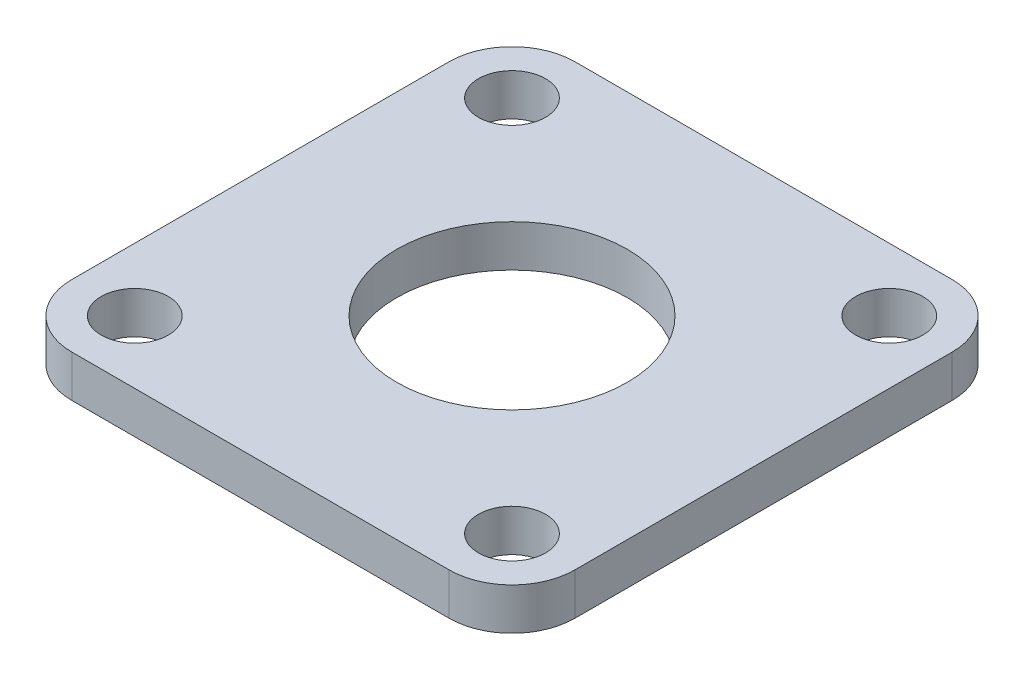
ISO-10303-21;
HEADER;
FILE_DESCRIPTION(('STEP AP214'),'2;1');
FILE_NAME('part.step','',(''),(''),'','','');
FILE_SCHEMA(('AUTOMOTIVE_DESIGN { 1 0 10303 214 1 1 1 1 }'));
ENDSEC;
DATA;
#1=APPLICATION_CONTEXT('core data for automotive mechanical design processes');
#2=APPLICATION_PROTOCOL_DEFINITION('international standard','automotive_design',2000,#1);
#3=PRODUCT_CONTEXT('',#1,'mechanical');
#4=PRODUCT('Part','Part','',(#3));
#5=PRODUCT_RELATED_PRODUCT_CATEGORY('part','',(#4));
#6=PRODUCT_DEFINITION_FORMATION('','',#4);
#7=PRODUCT_DEFINITION_CONTEXT('part definition',#1,'design');
#8=PRODUCT_DEFINITION('design','',#6,#7);
#9=PRODUCT_DEFINITION_SHAPE('','',#8);
#10=(LENGTH_UNIT() NAMED_UNIT(*) SI_UNIT(.MILLI.,.METRE.));
#11=(NAMED_UNIT(*) PLANE_ANGLE_UNIT() SI_UNIT($,.RADIAN.));
#12=(NAMED_UNIT(*) SI_UNIT($,.STERADIAN.) SOLID_ANGLE_UNIT());
#13=UNCERTAINTY_MEASURE_WITH_UNIT(LENGTH_MEASURE(1.E-05),#10,'distance_accuracy_value','');
#14=(GEOMETRIC_REPRESENTATION_CONTEXT(3) GLOBAL_UNCERTAINTY_ASSIGNED_CONTEXT((#13)) GLOBAL_UNIT_ASSIGNED_CONTEXT((#10,
#11,#12)) REPRESENTATION_CONTEXT('',''));
#15=CARTESIAN_POINT('',(0.,0.,0.));
#16=DIRECTION('',(0.,0.,1.));
#17=DIRECTION('',(1.,0.,0.));
#18=AXIS2_PLACEMENT_3D('',#15,#16,#17);
#19=CARTESIAN_POINT('',(12.,2.,12.));
#20=DIRECTION('',(-1.,0.,0.));
#21=DIRECTION('',(0.,0.,1.));
#22=AXIS2_PLACEMENT_3D('',#19,#20,#21);
#23=PLANE('',#22);
#24=DIRECTION('',(0.,0.,-1.));
#25=VECTOR('',#24,1.);
#26=CARTESIAN_POINT('',(12.,0.,12.));
#27=LINE('',#26,#25);
#28=CARTESIAN_POINT('',(12.,0.,9.));
#29=VERTEX_POINT('',#28);
#30=CARTESIAN_POINT('',(12.,0.,-9.));
#31=VERTEX_POINT('',#30);
#32=EDGE_CURVE('E181',#29,#31,#27,.T.);
#33=ORIENTED_EDGE('',*,*,#32,.T.);
#34=DIRECTION('',(0.,-1.,0.));
#35=VECTOR('',#34,1.);
#36=CARTESIAN_POINT('',(12.,2.,-9.));
#37=LINE('',#36,#35);
#38=CARTESIAN_POINT('',(12.,2.,-9.));
#39=VERTEX_POINT('',#38);
#40=EDGE_CURVE('E11',#31,#39,#37,.F.);
#41=ORIENTED_EDGE('',*,*,#40,.T.);
#42=DIRECTION('',(0.,0.,-1.));
#43=VECTOR('',#42,1.);
#44=CARTESIAN_POINT('',(12.,2.,12.));
#45=LINE('',#44,#43);
#46=CARTESIAN_POINT('',(12.,2.,9.));
#47=VERTEX_POINT('',#46);
#48=EDGE_CURVE('E134',#47,#39,#45,.T.);
#49=ORIENTED_EDGE('',*,*,#48,.F.);
#50=DIRECTION('',(0.,-1.,0.));
#51=VECTOR('',#50,1.);
#52=CARTESIAN_POINT('',(12.,2.,9.));
#53=LINE('',#52,#51);
#54=EDGE_CURVE('E47',#47,#29,#53,.T.);
#55=ORIENTED_EDGE('',*,*,#54,.T.);
#56=EDGE_LOOP('',(#33,#41,#49,#55));
#57=FACE_BOUND('',#56,.T.);
#58=ADVANCED_FACE('F38',(#57),#23,.F.);
#59=CARTESIAN_POINT('',(-12.,2.,-12.));
#60=DIRECTION('',(0.,0.,1.));
#61=DIRECTION('',(1.,0.,0.));
#62=AXIS2_PLACEMENT_3D('',#59,#60,#61);
#63=PLANE('',#62);
#64=DIRECTION('',(-1.,0.,0.));
#65=VECTOR('',#64,1.);
#66=CARTESIAN_POINT('',(-12.,0.,-12.));
#67=LINE('',#66,#65);
#68=CARTESIAN_POINT('',(9.,0.,-12.));
#69=VERTEX_POINT('',#68);
#70=CARTESIAN_POINT('',(-9.,0.,-12.));
#71=VERTEX_POINT('',#70);
#72=EDGE_CURVE('E141',#69,#71,#67,.T.);
#73=ORIENTED_EDGE('',*,*,#72,.T.);
#74=DIRECTION('',(0.,-1.,0.));
#75=VECTOR('',#74,1.);
#76=CARTESIAN_POINT('',(-9.,2.,-12.));
#77=LINE('',#76,#75);
#78=CARTESIAN_POINT('',(-9.,2.,-12.));
#79=VERTEX_POINT('',#78);
#80=EDGE_CURVE('E54',#71,#79,#77,.F.);
#81=ORIENTED_EDGE('',*,*,#80,.T.);
#82=DIRECTION('',(-1.,0.,0.));
#83=VECTOR('',#82,1.);
#84=CARTESIAN_POINT('',(-12.,2.,-12.));
#85=LINE('',#84,#83);
#86=CARTESIAN_POINT('',(9.,2.,-12.));
#87=VERTEX_POINT('',#86);
#88=EDGE_CURVE('E139',#87,#79,#85,.T.);
#89=ORIENTED_EDGE('',*,*,#88,.F.);
#90=DIRECTION('',(0.,-1.,0.));
#91=VECTOR('',#90,1.);
#92=CARTESIAN_POINT('',(9.,2.,-12.));
#93=LINE('',#92,#91);
#94=EDGE_CURVE('E170',#87,#69,#93,.T.);
#95=ORIENTED_EDGE('',*,*,#94,.T.);
#96=EDGE_LOOP('',(#73,#81,#89,#95));
#97=FACE_BOUND('',#96,.T.);
#98=ADVANCED_FACE('F266',(#97),#63,.F.);
#99=CARTESIAN_POINT('',(-12.,2.,12.));
#100=DIRECTION('',(1.,0.,0.));
#101=DIRECTION('',(0.,0.,-1.));
#102=AXIS2_PLACEMENT_3D('',#99,#100,#101);
#103=PLANE('',#102);
#104=DIRECTION('',(0.,0.,1.));
#105=VECTOR('',#104,1.);
#106=CARTESIAN_POINT('',(-12.,0.,12.));
#107=LINE('',#106,#105);
#108=CARTESIAN_POINT('',(-12.,0.,-9.));
#109=VERTEX_POINT('',#108);
#110=CARTESIAN_POINT('',(-12.,0.,9.));
#111=VERTEX_POINT('',#110);
#112=EDGE_CURVE('E135',#109,#111,#107,.T.);
#113=ORIENTED_EDGE('',*,*,#112,.T.);
#114=DIRECTION('',(0.,-1.,0.));
#115=VECTOR('',#114,1.);
#116=CARTESIAN_POINT('',(-12.,2.,9.));
#117=LINE('',#116,#115);
#118=CARTESIAN_POINT('',(-12.,2.,9.));
#119=VERTEX_POINT('',#118);
#120=EDGE_CURVE('E110',#111,#119,#117,.F.);
#121=ORIENTED_EDGE('',*,*,#120,.T.);
#122=DIRECTION('',(0.,0.,1.));
#123=VECTOR('',#122,1.);
#124=CARTESIAN_POINT('',(-12.,2.,12.));
#125=LINE('',#124,#123);
#126=CARTESIAN_POINT('',(-12.,2.,-9.));
#127=VERTEX_POINT('',#126);
#128=EDGE_CURVE('E197',#127,#119,#125,.T.);
#129=ORIENTED_EDGE('',*,*,#128,.F.);
#130=DIRECTION('',(0.,-1.,0.));
#131=VECTOR('',#130,1.);
#132=CARTESIAN_POINT('',(-12.,2.,-9.));
#133=LINE('',#132,#131);
#134=EDGE_CURVE('E116',#127,#109,#133,.T.);
#135=ORIENTED_EDGE('',*,*,#134,.T.);
#136=EDGE_LOOP('',(#113,#121,#129,#135));
#137=FACE_BOUND('',#136,.T.);
#138=ADVANCED_FACE('F263',(#137),#103,.F.);
#139=CARTESIAN_POINT('',(-12.,2.,12.));
#140=DIRECTION('',(0.,0.,-1.));
#141=DIRECTION('',(-1.,0.,0.));
#142=AXIS2_PLACEMENT_3D('',#139,#140,#141);
#143=PLANE('',#142);
#144=DIRECTION('',(1.,0.,0.));
#145=VECTOR('',#144,1.);
#146=CARTESIAN_POINT('',(-12.,2.,12.));
#147=LINE('',#146,#145);
#148=CARTESIAN_POINT('',(-9.,2.,12.));
#149=VERTEX_POINT('',#148);
#150=CARTESIAN_POINT('',(9.,2.,12.));
#151=VERTEX_POINT('',#150);
#152=EDGE_CURVE('E126',#149,#151,#147,.T.);
#153=ORIENTED_EDGE('',*,*,#152,.F.);
#154=DIRECTION('',(0.,-1.,0.));
#155=VECTOR('',#154,1.);
#156=CARTESIAN_POINT('',(-9.,2.,12.));
#157=LINE('',#156,#155);
#158=CARTESIAN_POINT('',(-9.,0.,12.));
#159=VERTEX_POINT('',#158);
#160=EDGE_CURVE('E109',#149,#159,#157,.T.);
#161=ORIENTED_EDGE('',*,*,#160,.T.);
#162=DIRECTION('',(1.,0.,0.));
#163=VECTOR('',#162,1.);
#164=CARTESIAN_POINT('',(-12.,0.,12.));
#165=LINE('',#164,#163);
#166=CARTESIAN_POINT('',(9.,0.,12.));
#167=VERTEX_POINT('',#166);
#168=EDGE_CURVE('E123',#159,#167,#165,.T.);
#169=ORIENTED_EDGE('',*,*,#168,.T.);
#170=DIRECTION('',(0.,-1.,0.));
#171=VECTOR('',#170,1.);
#172=CARTESIAN_POINT('',(9.,2.,12.));
#173=LINE('',#172,#171);
#174=EDGE_CURVE('E129',#167,#151,#173,.F.);
#175=ORIENTED_EDGE('',*,*,#174,.T.);
#176=EDGE_LOOP('',(#153,#161,#169,#175));
#177=FACE_BOUND('',#176,.T.);
#178=ADVANCED_FACE('F122',(#177),#143,.F.);
#179=CARTESIAN_POINT('',(0.,2.,0.));
#180=DIRECTION('',(0.,-1.,0.));
#181=DIRECTION('',(0.,0.,-1.));
#182=AXIS2_PLACEMENT_3D('',#179,#180,#181);
#183=PLANE('',#182);
#184=CARTESIAN_POINT('',(0.,2.,0.));
#185=DIRECTION('',(0.,1.,0.));
#186=DIRECTION('',(0.,0.,1.));
#187=AXIS2_PLACEMENT_3D('',#184,#185,#186);
#188=CIRCLE('',#187,5.5);
#189=CARTESIAN_POINT('',(0.,2.,5.5));
#190=VERTEX_POINT('',#189);
#191=EDGE_CURVE('E231',#190,#190,#188,.T.);
#192=ORIENTED_EDGE('',*,*,#191,.F.);
#193=EDGE_LOOP('',(#192));
#194=FACE_BOUND('',#193,.T.);
#195=CARTESIAN_POINT('',(-9.,2.,9.));
#196=DIRECTION('',(0.,1.,0.));
#197=DIRECTION('',(0.,0.,1.));
#198=AXIS2_PLACEMENT_3D('',#195,#196,#197);
#199=CIRCLE('',#198,1.6);
#200=CARTESIAN_POINT('',(-9.,2.,10.6));
#201=VERTEX_POINT('',#200);
#202=EDGE_CURVE('E207',#201,#201,#199,.T.);
#203=ORIENTED_EDGE('',*,*,#202,.F.);
#204=EDGE_LOOP('',(#203));
#205=FACE_BOUND('',#204,.T.);
#206=CARTESIAN_POINT('',(9.,2.,9.));
#207=DIRECTION('',(0.,1.,0.));
#208=DIRECTION('',(0.,0.,1.));
#209=AXIS2_PLACEMENT_3D('',#206,#207,#208);
#210=CIRCLE('',#209,1.6);
#211=CARTESIAN_POINT('',(9.,2.,10.6));
#212=VERTEX_POINT('',#211);
#213=EDGE_CURVE('E216',#212,#212,#210,.T.);
#214=ORIENTED_EDGE('',*,*,#213,.F.);
#215=EDGE_LOOP('',(#214));
#216=FACE_BOUND('',#215,.T.);
#217=CARTESIAN_POINT('',(9.,2.,-9.));
#218=DIRECTION('',(0.,1.,0.));
#219=DIRECTION('',(0.,0.,1.));
#220=AXIS2_PLACEMENT_3D('',#217,#218,#219);
#221=CIRCLE('',#220,1.6);
#222=CARTESIAN_POINT('',(9.,2.,-7.4));
#223=VERTEX_POINT('',#222);
#224=EDGE_CURVE('E224',#223,#223,#221,.T.);
#225=ORIENTED_EDGE('',*,*,#224,.F.);
#226=EDGE_LOOP('',(#225));
#227=FACE_BOUND('',#226,.T.);
#228=CARTESIAN_POINT('',(-9.,2.,-9.));
#229=DIRECTION('',(0.,1.,0.));
#230=DIRECTION('',(0.,0.,1.));
#231=AXIS2_PLACEMENT_3D('',#228,#229,#230);
#232=CIRCLE('',#231,1.6);
#233=CARTESIAN_POINT('',(-9.,2.,-7.4));
#234=VERTEX_POINT('',#233);
#235=EDGE_CURVE('E192',#234,#234,#232,.T.);
#236=ORIENTED_EDGE('',*,*,#235,.F.);
#237=EDGE_LOOP('',(#236));
#238=FACE_BOUND('',#237,.T.);
#239=ORIENTED_EDGE('',*,*,#128,.T.);
#240=CARTESIAN_POINT('',(-9.,2.,9.));
#241=DIRECTION('',(0.,-1.,0.));
#242=DIRECTION('',(0.,0.,-1.));
#243=AXIS2_PLACEMENT_3D('',#240,#241,#242);
#244=CIRCLE('',#243,3.);
#245=EDGE_CURVE('E167',#119,#149,#244,.F.);
#246=ORIENTED_EDGE('',*,*,#245,.T.);
#247=ORIENTED_EDGE('',*,*,#152,.T.);
#248=CARTESIAN_POINT('',(9.,2.,9.));
#249=DIRECTION('',(0.,-1.,0.));
#250=DIRECTION('',(0.,0.,-1.));
#251=AXIS2_PLACEMENT_3D('',#248,#249,#250);
#252=CIRCLE('',#251,3.);
#253=EDGE_CURVE('E159',#151,#47,#252,.F.);
#254=ORIENTED_EDGE('',*,*,#253,.T.);
#255=ORIENTED_EDGE('',*,*,#48,.T.);
#256=CARTESIAN_POINT('',(9.,2.,-9.));
#257=DIRECTION('',(0.,-1.,0.));
#258=DIRECTION('',(0.,0.,-1.));
#259=AXIS2_PLACEMENT_3D('',#256,#257,#258);
#260=CIRCLE('',#259,3.);
#261=EDGE_CURVE('E61',#39,#87,#260,.F.);
#262=ORIENTED_EDGE('',*,*,#261,.T.);
#263=ORIENTED_EDGE('',*,*,#88,.T.);
#264=CARTESIAN_POINT('',(-9.,2.,-9.));
#265=DIRECTION('',(0.,-1.,0.));
#266=DIRECTION('',(0.,0.,-1.));
#267=AXIS2_PLACEMENT_3D('',#264,#265,#266);
#268=CIRCLE('',#267,3.);
#269=EDGE_CURVE('E164',#79,#127,#268,.F.);
#270=ORIENTED_EDGE('',*,*,#269,.T.);
#271=EDGE_LOOP('',(#239,#246,#247,#254,#255,#262,#263,#270));
#272=FACE_BOUND('',#271,.T.);
#273=ADVANCED_FACE('F248',(#194,#205,#216,#227,#238,#272),#183,.F.);
#274=CARTESIAN_POINT('',(0.,0.,0.));
#275=DIRECTION('',(0.,-1.,0.));
#276=DIRECTION('',(0.,0.,-1.));
#277=AXIS2_PLACEMENT_3D('',#274,#275,#276);
#278=PLANE('',#277);
#279=CARTESIAN_POINT('',(0.,0.,0.));
#280=DIRECTION('',(0.,1.,0.));
#281=DIRECTION('',(0.,0.,1.));
#282=AXIS2_PLACEMENT_3D('',#279,#280,#281);
#283=CIRCLE('',#282,5.5);
#284=CARTESIAN_POINT('',(0.,0.,5.5));
#285=VERTEX_POINT('',#284);
#286=EDGE_CURVE('E212',#285,#285,#283,.T.);
#287=ORIENTED_EDGE('',*,*,#286,.T.);
#288=EDGE_LOOP('',(#287));
#289=FACE_BOUND('',#288,.T.);
#290=CARTESIAN_POINT('',(-9.,0.,9.));
#291=DIRECTION('',(0.,1.,0.));
#292=DIRECTION('',(0.,0.,1.));
#293=AXIS2_PLACEMENT_3D('',#290,#291,#292);
#294=CIRCLE('',#293,1.6);
#295=CARTESIAN_POINT('',(-9.,0.,10.6));
#296=VERTEX_POINT('',#295);
#297=EDGE_CURVE('E211',#296,#296,#294,.T.);
#298=ORIENTED_EDGE('',*,*,#297,.T.);
#299=EDGE_LOOP('',(#298));
#300=FACE_BOUND('',#299,.T.);
#301=CARTESIAN_POINT('',(9.,0.,9.));
#302=DIRECTION('',(0.,1.,0.));
#303=DIRECTION('',(0.,0.,1.));
#304=AXIS2_PLACEMENT_3D('',#301,#302,#303);
#305=CIRCLE('',#304,1.6);
#306=CARTESIAN_POINT('',(9.,0.,10.6));
#307=VERTEX_POINT('',#306);
#308=EDGE_CURVE('E220',#307,#307,#305,.T.);
#309=ORIENTED_EDGE('',*,*,#308,.T.);
#310=EDGE_LOOP('',(#309));
#311=FACE_BOUND('',#310,.T.);
#312=CARTESIAN_POINT('',(9.,0.,-9.));
#313=DIRECTION('',(0.,1.,0.));
#314=DIRECTION('',(0.,0.,1.));
#315=AXIS2_PLACEMENT_3D('',#312,#313,#314);
#316=CIRCLE('',#315,1.6);
#317=CARTESIAN_POINT('',(9.,0.,-7.4));
#318=VERTEX_POINT('',#317);
#319=EDGE_CURVE('E205',#318,#318,#316,.T.);
#320=ORIENTED_EDGE('',*,*,#319,.T.);
#321=EDGE_LOOP('',(#320));
#322=FACE_BOUND('',#321,.T.);
#323=CARTESIAN_POINT('',(-9.,0.,-9.));
#324=DIRECTION('',(0.,1.,0.));
#325=DIRECTION('',(0.,0.,1.));
#326=AXIS2_PLACEMENT_3D('',#323,#324,#325);
#327=CIRCLE('',#326,1.6);
#328=CARTESIAN_POINT('',(-9.,0.,-7.4));
#329=VERTEX_POINT('',#328);
#330=EDGE_CURVE('E187',#329,#329,#327,.T.);
#331=ORIENTED_EDGE('',*,*,#330,.T.);
#332=EDGE_LOOP('',(#331));
#333=FACE_BOUND('',#332,.T.);
#334=ORIENTED_EDGE('',*,*,#168,.F.);
#335=CARTESIAN_POINT('',(-9.,0.,9.));
#336=DIRECTION('',(0.,-1.,0.));
#337=DIRECTION('',(0.,0.,-1.));
#338=AXIS2_PLACEMENT_3D('',#335,#336,#337);
#339=CIRCLE('',#338,3.);
#340=EDGE_CURVE('E105',#159,#111,#339,.T.);
#341=ORIENTED_EDGE('',*,*,#340,.T.);
#342=ORIENTED_EDGE('',*,*,#112,.F.);
#343=CARTESIAN_POINT('',(-9.,0.,-9.));
#344=DIRECTION('',(0.,-1.,0.));
#345=DIRECTION('',(0.,0.,-1.));
#346=AXIS2_PLACEMENT_3D('',#343,#344,#345);
#347=CIRCLE('',#346,3.);
#348=EDGE_CURVE('E117',#109,#71,#347,.T.);
#349=ORIENTED_EDGE('',*,*,#348,.T.);
#350=ORIENTED_EDGE('',*,*,#72,.F.);
#351=CARTESIAN_POINT('',(9.,0.,-9.));
#352=DIRECTION('',(0.,-1.,0.));
#353=DIRECTION('',(0.,0.,-1.));
#354=AXIS2_PLACEMENT_3D('',#351,#352,#353);
#355=CIRCLE('',#354,3.);
#356=EDGE_CURVE('E149',#69,#31,#355,.T.);
#357=ORIENTED_EDGE('',*,*,#356,.T.);
#358=ORIENTED_EDGE('',*,*,#32,.F.);
#359=CARTESIAN_POINT('',(9.,0.,9.));
#360=DIRECTION('',(0.,-1.,0.));
#361=DIRECTION('',(0.,0.,-1.));
#362=AXIS2_PLACEMENT_3D('',#359,#360,#361);
#363=CIRCLE('',#362,3.);
#364=EDGE_CURVE('E128',#29,#167,#363,.T.);
#365=ORIENTED_EDGE('',*,*,#364,.T.);
#366=EDGE_LOOP('',(#334,#341,#342,#349,#350,#357,#358,#365));
#367=FACE_BOUND('',#366,.T.);
#368=ADVANCED_FACE('F131',(#289,#300,#311,#322,#333,#367),#278,.T.);
#369=CARTESIAN_POINT('',(-9.,2.,9.));
#370=DIRECTION('',(0.,-1.,0.));
#371=DIRECTION('',(0.,0.,-1.));
#372=AXIS2_PLACEMENT_3D('',#369,#370,#371);
#373=CYLINDRICAL_SURFACE('',#372,3.);
#374=ORIENTED_EDGE('',*,*,#245,.F.);
#375=ORIENTED_EDGE('',*,*,#120,.F.);
#376=ORIENTED_EDGE('',*,*,#340,.F.);
#377=ORIENTED_EDGE('',*,*,#160,.F.);
#378=EDGE_LOOP('',(#374,#375,#376,#377));
#379=FACE_BOUND('',#378,.T.);
#380=ADVANCED_FACE('F108',(#379),#373,.T.);
#381=CARTESIAN_POINT('',(-9.,2.,-9.));
#382=DIRECTION('',(0.,-1.,0.));
#383=DIRECTION('',(0.,0.,-1.));
#384=AXIS2_PLACEMENT_3D('',#381,#382,#383);
#385=CYLINDRICAL_SURFACE('',#384,3.);
#386=ORIENTED_EDGE('',*,*,#269,.F.);
#387=ORIENTED_EDGE('',*,*,#80,.F.);
#388=ORIENTED_EDGE('',*,*,#348,.F.);
#389=ORIENTED_EDGE('',*,*,#134,.F.);
#390=EDGE_LOOP('',(#386,#387,#388,#389));
#391=FACE_BOUND('',#390,.T.);
#392=ADVANCED_FACE('F265',(#391),#385,.T.);
#393=CARTESIAN_POINT('',(9.,2.,-9.));
#394=DIRECTION('',(0.,-1.,0.));
#395=DIRECTION('',(0.,0.,-1.));
#396=AXIS2_PLACEMENT_3D('',#393,#394,#395);
#397=CYLINDRICAL_SURFACE('',#396,3.);
#398=ORIENTED_EDGE('',*,*,#261,.F.);
#399=ORIENTED_EDGE('',*,*,#40,.F.);
#400=ORIENTED_EDGE('',*,*,#356,.F.);
#401=ORIENTED_EDGE('',*,*,#94,.F.);
#402=EDGE_LOOP('',(#398,#399,#400,#401));
#403=FACE_BOUND('',#402,.T.);
#404=ADVANCED_FACE('F269',(#403),#397,.T.);
#405=CARTESIAN_POINT('',(9.,2.,9.));
#406=DIRECTION('',(0.,-1.,0.));
#407=DIRECTION('',(0.,0.,-1.));
#408=AXIS2_PLACEMENT_3D('',#405,#406,#407);
#409=CYLINDRICAL_SURFACE('',#408,3.);
#410=ORIENTED_EDGE('',*,*,#253,.F.);
#411=ORIENTED_EDGE('',*,*,#174,.F.);
#412=ORIENTED_EDGE('',*,*,#364,.F.);
#413=ORIENTED_EDGE('',*,*,#54,.F.);
#414=EDGE_LOOP('',(#410,#411,#412,#413));
#415=FACE_BOUND('',#414,.T.);
#416=ADVANCED_FACE('F40',(#415),#409,.T.);
#417=CARTESIAN_POINT('',(-9.,0.,-9.));
#418=DIRECTION('',(0.,1.,0.));
#419=DIRECTION('',(0.,0.,1.));
#420=AXIS2_PLACEMENT_3D('',#417,#418,#419);
#421=CYLINDRICAL_SURFACE('',#420,1.6);
#422=ORIENTED_EDGE('',*,*,#330,.F.);
#423=EDGE_LOOP('',(#422));
#424=FACE_BOUND('',#423,.T.);
#425=ORIENTED_EDGE('',*,*,#235,.T.);
#426=EDGE_LOOP('',(#425));
#427=FACE_BOUND('',#426,.T.);
#428=ADVANCED_FACE('F271',(#424,#427),#421,.F.);
#429=CARTESIAN_POINT('',(9.,0.,-9.));
#430=DIRECTION('',(0.,1.,0.));
#431=DIRECTION('',(0.,0.,1.));
#432=AXIS2_PLACEMENT_3D('',#429,#430,#431);
#433=CYLINDRICAL_SURFACE('',#432,1.6);
#434=ORIENTED_EDGE('',*,*,#319,.F.);
#435=EDGE_LOOP('',(#434));
#436=FACE_BOUND('',#435,.T.);
#437=ORIENTED_EDGE('',*,*,#224,.T.);
#438=EDGE_LOOP('',(#437));
#439=FACE_BOUND('',#438,.T.);
#440=ADVANCED_FACE('F276',(#436,#439),#433,.F.);
#441=CARTESIAN_POINT('',(9.,0.,9.));
#442=DIRECTION('',(0.,1.,0.));
#443=DIRECTION('',(0.,0.,1.));
#444=AXIS2_PLACEMENT_3D('',#441,#442,#443);
#445=CYLINDRICAL_SURFACE('',#444,1.6);
#446=ORIENTED_EDGE('',*,*,#308,.F.);
#447=EDGE_LOOP('',(#446));
#448=FACE_BOUND('',#447,.T.);
#449=ORIENTED_EDGE('',*,*,#213,.T.);
#450=EDGE_LOOP('',(#449));
#451=FACE_BOUND('',#450,.T.);
#452=ADVANCED_FACE('F318',(#448,#451),#445,.F.);
#453=CARTESIAN_POINT('',(-9.,0.,9.));
#454=DIRECTION('',(0.,1.,0.));
#455=DIRECTION('',(0.,0.,1.));
#456=AXIS2_PLACEMENT_3D('',#453,#454,#455);
#457=CYLINDRICAL_SURFACE('',#456,1.6);
#458=ORIENTED_EDGE('',*,*,#297,.F.);
#459=EDGE_LOOP('',(#458));
#460=FACE_BOUND('',#459,.T.);
#461=ORIENTED_EDGE('',*,*,#202,.T.);
#462=EDGE_LOOP('',(#461));
#463=FACE_BOUND('',#462,.T.);
#464=ADVANCED_FACE('F244',(#460,#463),#457,.F.);
#465=CARTESIAN_POINT('',(0.,0.,0.));
#466=DIRECTION('',(0.,1.,0.));
#467=DIRECTION('',(0.,0.,1.));
#468=AXIS2_PLACEMENT_3D('',#465,#466,#467);
#469=CYLINDRICAL_SURFACE('',#468,5.5);
#470=ORIENTED_EDGE('',*,*,#286,.F.);
#471=EDGE_LOOP('',(#470));
#472=FACE_BOUND('',#471,.T.);
#473=ORIENTED_EDGE('',*,*,#191,.T.);
#474=EDGE_LOOP('',(#473));
#475=FACE_BOUND('',#474,.T.);
#476=ADVANCED_FACE('F241',(#472,#475),#469,.F.);
#477=CLOSED_SHELL('',(#58,#98,#138,#178,#273,#368,#380,#392,#404,#416,#428,#440,#452,#464,#476));
#478=MANIFOLD_SOLID_BREP('B2',#477);
#479=ADVANCED_BREP_SHAPE_REPRESENTATION('',(#18,#478),#14);
#480=SHAPE_DEFINITION_REPRESENTATION(#9,#479);
ENDSEC;
END-ISO-10303-21;
